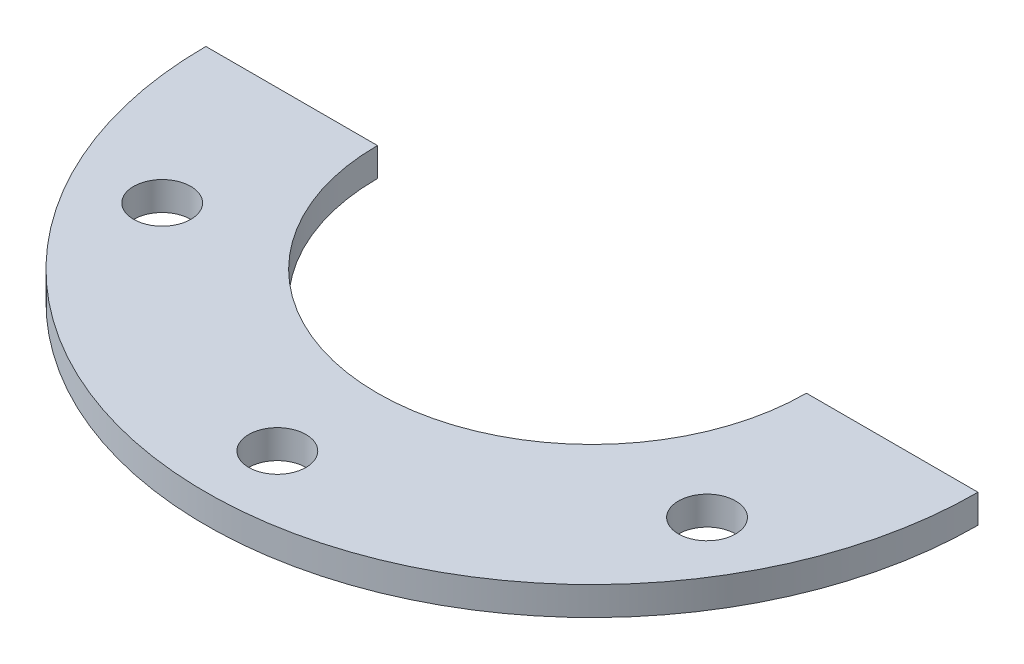
ISO-10303-21;
HEADER;
FILE_DESCRIPTION(('STEP AP214'),'2;1');
FILE_NAME('part.step','',(''),(''),'','','');
FILE_SCHEMA(('AUTOMOTIVE_DESIGN { 1 0 10303 214 1 1 1 1 }'));
ENDSEC;
DATA;
#1=APPLICATION_CONTEXT('core data for automotive mechanical design processes');
#2=APPLICATION_PROTOCOL_DEFINITION('international standard','automotive_design',2000,#1);
#3=PRODUCT_CONTEXT('',#1,'mechanical');
#4=PRODUCT('Part','Part','',(#3));
#5=PRODUCT_RELATED_PRODUCT_CATEGORY('part','',(#4));
#6=PRODUCT_DEFINITION_FORMATION('','',#4);
#7=PRODUCT_DEFINITION_CONTEXT('part definition',#1,'design');
#8=PRODUCT_DEFINITION('design','',#6,#7);
#9=PRODUCT_DEFINITION_SHAPE('','',#8);
#10=(LENGTH_UNIT() NAMED_UNIT(*) SI_UNIT(.MILLI.,.METRE.));
#11=(NAMED_UNIT(*) PLANE_ANGLE_UNIT() SI_UNIT($,.RADIAN.));
#12=(NAMED_UNIT(*) SI_UNIT($,.STERADIAN.) SOLID_ANGLE_UNIT());
#13=UNCERTAINTY_MEASURE_WITH_UNIT(LENGTH_MEASURE(1.E-05),#10,'distance_accuracy_value','');
#14=(GEOMETRIC_REPRESENTATION_CONTEXT(3) GLOBAL_UNCERTAINTY_ASSIGNED_CONTEXT((#13)) GLOBAL_UNIT_ASSIGNED_CONTEXT((#10,
#11,#12)) REPRESENTATION_CONTEXT('',''));
#15=CARTESIAN_POINT('',(0.,0.,0.));
#16=DIRECTION('',(0.,0.,1.));
#17=DIRECTION('',(1.,0.,0.));
#18=AXIS2_PLACEMENT_3D('',#15,#16,#17);
#19=CARTESIAN_POINT('',(0.,1.,0.));
#20=DIRECTION('',(0.,-1.,0.));
#21=DIRECTION('',(0.,0.,-1.));
#22=AXIS2_PLACEMENT_3D('',#19,#20,#21);
#23=CYLINDRICAL_SURFACE('',#22,13.5);
#24=CARTESIAN_POINT('',(0.,1.,0.));
#25=DIRECTION('',(0.,1.,0.));
#26=DIRECTION('',(0.,0.,1.));
#27=AXIS2_PLACEMENT_3D('',#24,#25,#26);
#28=CIRCLE('',#27,13.5);
#29=CARTESIAN_POINT('',(-13.5,1.,0.));
#30=VERTEX_POINT('',#29);
#31=CARTESIAN_POINT('',(13.5,1.,0.));
#32=VERTEX_POINT('',#31);
#33=EDGE_CURVE('E77',#30,#32,#28,.T.);
#34=ORIENTED_EDGE('',*,*,#33,.F.);
#35=DIRECTION('',(0.,-1.,0.));
#36=VECTOR('',#35,1.);
#37=CARTESIAN_POINT('',(-13.5,1.,0.));
#38=LINE('',#37,#36);
#39=CARTESIAN_POINT('',(-13.5,0.,0.));
#40=VERTEX_POINT('',#39);
#41=EDGE_CURVE('E119',#30,#40,#38,.T.);
#42=ORIENTED_EDGE('',*,*,#41,.T.);
#43=CARTESIAN_POINT('',(0.,0.,0.));
#44=DIRECTION('',(0.,1.,0.));
#45=DIRECTION('',(0.,0.,1.));
#46=AXIS2_PLACEMENT_3D('',#43,#44,#45);
#47=CIRCLE('',#46,13.5);
#48=CARTESIAN_POINT('',(13.5,0.,0.));
#49=VERTEX_POINT('',#48);
#50=EDGE_CURVE('E85',#40,#49,#47,.T.);
#51=ORIENTED_EDGE('',*,*,#50,.T.);
#52=DIRECTION('',(0.,-1.,0.));
#53=VECTOR('',#52,1.);
#54=CARTESIAN_POINT('',(13.5,1.,0.));
#55=LINE('',#54,#53);
#56=EDGE_CURVE('E89',#49,#32,#55,.F.);
#57=ORIENTED_EDGE('',*,*,#56,.T.);
#58=EDGE_LOOP('',(#34,#42,#51,#57));
#59=FACE_BOUND('',#58,.T.);
#60=ADVANCED_FACE('F33',(#59),#23,.T.);
#61=CARTESIAN_POINT('',(0.,1.,0.));
#62=DIRECTION('',(0.,1.,0.));
#63=DIRECTION('',(0.,0.,1.));
#64=AXIS2_PLACEMENT_3D('',#61,#62,#63);
#65=PLANE('',#64);
#66=DIRECTION('',(1.,0.,0.));
#67=VECTOR('',#66,1.);
#68=CARTESIAN_POINT('',(0.,1.,0.));
#69=LINE('',#68,#67);
#70=CARTESIAN_POINT('',(-7.5,1.,0.));
#71=VERTEX_POINT('',#70);
#72=EDGE_CURVE('E54',#30,#71,#69,.T.);
#73=ORIENTED_EDGE('',*,*,#72,.F.);
#74=ORIENTED_EDGE('',*,*,#33,.T.);
#75=CARTESIAN_POINT('',(7.5,1.,0.));
#76=VERTEX_POINT('',#75);
#77=EDGE_CURVE('E94',#76,#32,#69,.T.);
#78=ORIENTED_EDGE('',*,*,#77,.F.);
#79=CARTESIAN_POINT('',(0.,1.,0.));
#80=DIRECTION('',(0.,1.,0.));
#81=DIRECTION('',(0.,0.,1.));
#82=AXIS2_PLACEMENT_3D('',#79,#80,#81);
#83=CIRCLE('',#82,7.5);
#84=EDGE_CURVE('E88',#71,#76,#83,.T.);
#85=ORIENTED_EDGE('',*,*,#84,.F.);
#86=EDGE_LOOP('',(#73,#74,#78,#85));
#87=FACE_BOUND('',#86,.T.);
#88=CARTESIAN_POINT('',(-9.52627944162847,1.,5.4999999999998));
#89=DIRECTION('',(0.,1.,0.));
#90=DIRECTION('',(0.,0.,1.));
#91=AXIS2_PLACEMENT_3D('',#88,#89,#90);
#92=CIRCLE('',#91,1.00000000000035);
#93=CARTESIAN_POINT('',(-9.52627944162847,1.,6.50000000000015));
#94=VERTEX_POINT('',#93);
#95=EDGE_CURVE('E112',#94,#94,#92,.T.);
#96=ORIENTED_EDGE('',*,*,#95,.F.);
#97=EDGE_LOOP('',(#96));
#98=FACE_BOUND('',#97,.T.);
#99=CARTESIAN_POINT('',(2.32162478298628E-13,1.,10.9999999999996));
#100=DIRECTION('',(0.,1.,0.));
#101=DIRECTION('',(0.,0.,1.));
#102=AXIS2_PLACEMENT_3D('',#99,#100,#101);
#103=CIRCLE('',#102,1.00000000000022);
#104=CARTESIAN_POINT('',(2.32162478298628E-13,1.,11.9999999999998));
#105=VERTEX_POINT('',#104);
#106=EDGE_CURVE('E109',#105,#105,#103,.T.);
#107=ORIENTED_EDGE('',*,*,#106,.F.);
#108=EDGE_LOOP('',(#107));
#109=FACE_BOUND('',#108,.T.);
#110=CARTESIAN_POINT('',(9.52627944162882,1.,5.4999999999996));
#111=DIRECTION('',(0.,1.,0.));
#112=DIRECTION('',(0.,0.,1.));
#113=AXIS2_PLACEMENT_3D('',#110,#111,#112);
#114=CIRCLE('',#113,1.00000000000043);
#115=CARTESIAN_POINT('',(9.52627944162882,1.,6.50000000000003));
#116=VERTEX_POINT('',#115);
#117=EDGE_CURVE('E104',#116,#116,#114,.T.);
#118=ORIENTED_EDGE('',*,*,#117,.F.);
#119=EDGE_LOOP('',(#118));
#120=FACE_BOUND('',#119,.T.);
#121=ADVANCED_FACE('F124',(#87,#98,#109,#120),#65,.T.);
#122=CARTESIAN_POINT('',(0.,0.,0.));
#123=DIRECTION('',(0.,1.,0.));
#124=DIRECTION('',(0.,0.,1.));
#125=AXIS2_PLACEMENT_3D('',#122,#123,#124);
#126=PLANE('',#125);
#127=ORIENTED_EDGE('',*,*,#50,.F.);
#128=DIRECTION('',(1.,0.,0.));
#129=VECTOR('',#128,1.);
#130=CARTESIAN_POINT('',(0.,0.,0.));
#131=LINE('',#130,#129);
#132=CARTESIAN_POINT('',(-7.5,0.,0.));
#133=VERTEX_POINT('',#132);
#134=EDGE_CURVE('E71',#40,#133,#131,.T.);
#135=ORIENTED_EDGE('',*,*,#134,.T.);
#136=CARTESIAN_POINT('',(0.,0.,0.));
#137=DIRECTION('',(0.,1.,0.));
#138=DIRECTION('',(0.,0.,1.));
#139=AXIS2_PLACEMENT_3D('',#136,#137,#138);
#140=CIRCLE('',#139,7.5);
#141=CARTESIAN_POINT('',(7.5,0.,0.));
#142=VERTEX_POINT('',#141);
#143=EDGE_CURVE('E83',#133,#142,#140,.T.);
#144=ORIENTED_EDGE('',*,*,#143,.T.);
#145=EDGE_CURVE('E47',#142,#49,#131,.T.);
#146=ORIENTED_EDGE('',*,*,#145,.T.);
#147=EDGE_LOOP('',(#127,#135,#144,#146));
#148=FACE_BOUND('',#147,.T.);
#149=CARTESIAN_POINT('',(-9.52627944162847,0.,5.4999999999998));
#150=DIRECTION('',(0.,1.,0.));
#151=DIRECTION('',(0.,0.,1.));
#152=AXIS2_PLACEMENT_3D('',#149,#150,#151);
#153=CIRCLE('',#152,1.00000000000035);
#154=CARTESIAN_POINT('',(-9.52627944162847,0.,6.50000000000015));
#155=VERTEX_POINT('',#154);
#156=EDGE_CURVE('E91',#155,#155,#153,.T.);
#157=ORIENTED_EDGE('',*,*,#156,.T.);
#158=EDGE_LOOP('',(#157));
#159=FACE_BOUND('',#158,.T.);
#160=CARTESIAN_POINT('',(2.32162478298628E-13,0.,10.9999999999996));
#161=DIRECTION('',(0.,1.,0.));
#162=DIRECTION('',(0.,0.,1.));
#163=AXIS2_PLACEMENT_3D('',#160,#161,#162);
#164=CIRCLE('',#163,1.00000000000022);
#165=CARTESIAN_POINT('',(2.32162478298628E-13,0.,11.9999999999998));
#166=VERTEX_POINT('',#165);
#167=EDGE_CURVE('E100',#166,#166,#164,.T.);
#168=ORIENTED_EDGE('',*,*,#167,.T.);
#169=EDGE_LOOP('',(#168));
#170=FACE_BOUND('',#169,.T.);
#171=CARTESIAN_POINT('',(9.52627944162882,0.,5.4999999999996));
#172=DIRECTION('',(0.,1.,0.));
#173=DIRECTION('',(0.,0.,1.));
#174=AXIS2_PLACEMENT_3D('',#171,#172,#173);
#175=CIRCLE('',#174,1.00000000000043);
#176=CARTESIAN_POINT('',(9.52627944162882,0.,6.50000000000003));
#177=VERTEX_POINT('',#176);
#178=EDGE_CURVE('E101',#177,#177,#175,.T.);
#179=ORIENTED_EDGE('',*,*,#178,.T.);
#180=EDGE_LOOP('',(#179));
#181=FACE_BOUND('',#180,.T.);
#182=ADVANCED_FACE('F81',(#148,#159,#170,#181),#126,.F.);
#183=CARTESIAN_POINT('',(9.52627944162882,0.,5.4999999999996));
#184=DIRECTION('',(0.,1.,0.));
#185=DIRECTION('',(0.,0.,1.));
#186=AXIS2_PLACEMENT_3D('',#183,#184,#185);
#187=CYLINDRICAL_SURFACE('',#186,1.00000000000043);
#188=ORIENTED_EDGE('',*,*,#117,.T.);
#189=EDGE_LOOP('',(#188));
#190=FACE_BOUND('',#189,.T.);
#191=ORIENTED_EDGE('',*,*,#178,.F.);
#192=EDGE_LOOP('',(#191));
#193=FACE_BOUND('',#192,.T.);
#194=ADVANCED_FACE('F134',(#190,#193),#187,.F.);
#195=CARTESIAN_POINT('',(2.32162478298628E-13,0.,10.9999999999996));
#196=DIRECTION('',(0.,1.,0.));
#197=DIRECTION('',(0.,0.,1.));
#198=AXIS2_PLACEMENT_3D('',#195,#196,#197);
#199=CYLINDRICAL_SURFACE('',#198,1.00000000000022);
#200=ORIENTED_EDGE('',*,*,#106,.T.);
#201=EDGE_LOOP('',(#200));
#202=FACE_BOUND('',#201,.T.);
#203=ORIENTED_EDGE('',*,*,#167,.F.);
#204=EDGE_LOOP('',(#203));
#205=FACE_BOUND('',#204,.T.);
#206=ADVANCED_FACE('F137',(#202,#205),#199,.F.);
#207=CARTESIAN_POINT('',(-9.52627944162847,0.,5.4999999999998));
#208=DIRECTION('',(0.,1.,0.));
#209=DIRECTION('',(0.,0.,1.));
#210=AXIS2_PLACEMENT_3D('',#207,#208,#209);
#211=CYLINDRICAL_SURFACE('',#210,1.00000000000035);
#212=ORIENTED_EDGE('',*,*,#95,.T.);
#213=EDGE_LOOP('',(#212));
#214=FACE_BOUND('',#213,.T.);
#215=ORIENTED_EDGE('',*,*,#156,.F.);
#216=EDGE_LOOP('',(#215));
#217=FACE_BOUND('',#216,.T.);
#218=ADVANCED_FACE('F166',(#214,#217),#211,.F.);
#219=CARTESIAN_POINT('',(0.,0.,0.));
#220=DIRECTION('',(0.,1.,0.));
#221=DIRECTION('',(0.,0.,1.));
#222=AXIS2_PLACEMENT_3D('',#219,#220,#221);
#223=CYLINDRICAL_SURFACE('',#222,7.5);
#224=ORIENTED_EDGE('',*,*,#84,.T.);
#225=DIRECTION('',(0.,1.,0.));
#226=VECTOR('',#225,1.);
#227=CARTESIAN_POINT('',(7.5,0.,0.));
#228=LINE('',#227,#226);
#229=EDGE_CURVE('E11',#76,#142,#228,.F.);
#230=ORIENTED_EDGE('',*,*,#229,.T.);
#231=ORIENTED_EDGE('',*,*,#143,.F.);
#232=DIRECTION('',(0.,1.,0.));
#233=VECTOR('',#232,1.);
#234=CARTESIAN_POINT('',(-7.5,0.,0.));
#235=LINE('',#234,#233);
#236=EDGE_CURVE('E40',#133,#71,#235,.T.);
#237=ORIENTED_EDGE('',*,*,#236,.T.);
#238=EDGE_LOOP('',(#224,#230,#231,#237));
#239=FACE_BOUND('',#238,.T.);
#240=ADVANCED_FACE('F87',(#239),#223,.F.);
#241=CARTESIAN_POINT('',(0.,0.,0.));
#242=DIRECTION('',(0.,0.,1.));
#243=DIRECTION('',(1.,0.,0.));
#244=AXIS2_PLACEMENT_3D('',#241,#242,#243);
#245=PLANE('',#244);
#246=ORIENTED_EDGE('',*,*,#72,.T.);
#247=ORIENTED_EDGE('',*,*,#236,.F.);
#248=ORIENTED_EDGE('',*,*,#134,.F.);
#249=ORIENTED_EDGE('',*,*,#41,.F.);
#250=EDGE_LOOP('',(#246,#247,#248,#249));
#251=FACE_BOUND('',#250,.T.);
#252=ADVANCED_FACE('F70',(#251),#245,.F.);
#253=ORIENTED_EDGE('',*,*,#145,.F.);
#254=ORIENTED_EDGE('',*,*,#229,.F.);
#255=ORIENTED_EDGE('',*,*,#77,.T.);
#256=ORIENTED_EDGE('',*,*,#56,.F.);
#257=EDGE_LOOP('',(#253,#254,#255,#256));
#258=FACE_BOUND('',#257,.T.);
#259=ADVANCED_FACE('F122',(#258),#245,.F.);
#260=CLOSED_SHELL('',(#60,#121,#182,#194,#206,#218,#240,#252,#259));
#261=MANIFOLD_SOLID_BREP('B2',#260);
#262=ADVANCED_BREP_SHAPE_REPRESENTATION('',(#18,#261),#14);
#263=SHAPE_DEFINITION_REPRESENTATION(#9,#262);
ENDSEC;
END-ISO-10303-21;
